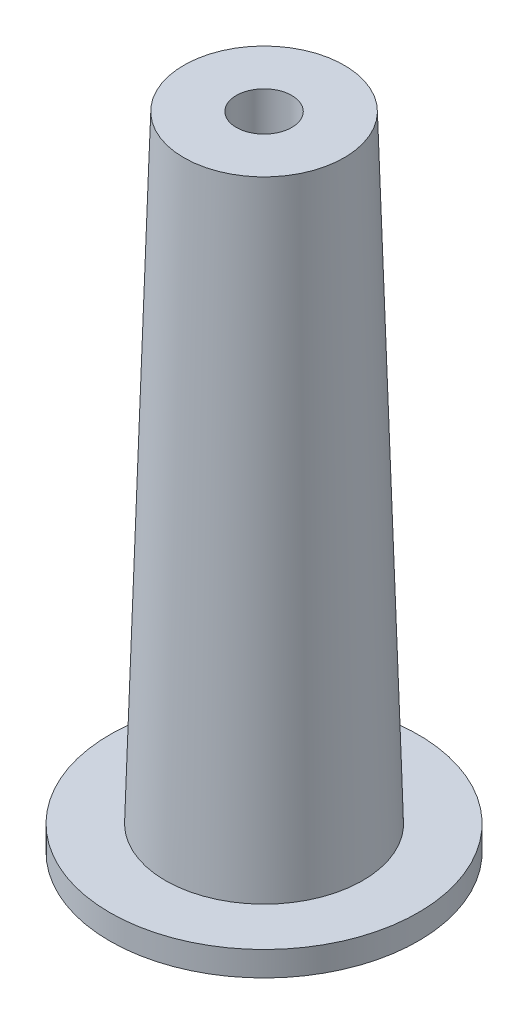
ISO-10303-21;
HEADER;
FILE_DESCRIPTION(('STEP AP214'),'2;1');
FILE_NAME('part.step','',(''),(''),'','','');
FILE_SCHEMA(('AUTOMOTIVE_DESIGN { 1 0 10303 214 1 1 1 1 }'));
ENDSEC;
DATA;
#1=APPLICATION_CONTEXT('core data for automotive mechanical design processes');
#2=APPLICATION_PROTOCOL_DEFINITION('international standard','automotive_design',2000,#1);
#3=PRODUCT_CONTEXT('',#1,'mechanical');
#4=PRODUCT('Part','Part','',(#3));
#5=PRODUCT_RELATED_PRODUCT_CATEGORY('part','',(#4));
#6=PRODUCT_DEFINITION_FORMATION('','',#4);
#7=PRODUCT_DEFINITION_CONTEXT('part definition',#1,'design');
#8=PRODUCT_DEFINITION('design','',#6,#7);
#9=PRODUCT_DEFINITION_SHAPE('','',#8);
#10=(LENGTH_UNIT() NAMED_UNIT(*) SI_UNIT(.MILLI.,.METRE.));
#11=(NAMED_UNIT(*) PLANE_ANGLE_UNIT() SI_UNIT($,.RADIAN.));
#12=(NAMED_UNIT(*) SI_UNIT($,.STERADIAN.) SOLID_ANGLE_UNIT());
#13=UNCERTAINTY_MEASURE_WITH_UNIT(LENGTH_MEASURE(1.E-05),#10,'distance_accuracy_value','');
#14=(GEOMETRIC_REPRESENTATION_CONTEXT(3) GLOBAL_UNCERTAINTY_ASSIGNED_CONTEXT((#13)) GLOBAL_UNIT_ASSIGNED_CONTEXT((#10,
#11,#12)) REPRESENTATION_CONTEXT('',''));
#15=CARTESIAN_POINT('',(0.,0.,0.));
#16=DIRECTION('',(0.,0.,1.));
#17=DIRECTION('',(1.,0.,0.));
#18=AXIS2_PLACEMENT_3D('',#15,#16,#17);
#19=CARTESIAN_POINT('',(0.,4.,0.));
#20=DIRECTION('',(0.,-1.,0.));
#21=DIRECTION('',(0.,0.,-1.));
#22=AXIS2_PLACEMENT_3D('',#19,#20,#21);
#23=CYLINDRICAL_SURFACE('',#22,25.);
#24=CARTESIAN_POINT('',(0.,4.,0.));
#25=DIRECTION('',(0.,1.,0.));
#26=DIRECTION('',(0.,0.,1.));
#27=AXIS2_PLACEMENT_3D('',#24,#25,#26);
#28=CIRCLE('',#27,25.);
#29=CARTESIAN_POINT('',(0.,4.,25.));
#30=VERTEX_POINT('',#29);
#31=EDGE_CURVE('E37',#30,#30,#28,.T.);
#32=ORIENTED_EDGE('',*,*,#31,.F.);
#33=EDGE_LOOP('',(#32));
#34=FACE_BOUND('',#33,.T.);
#35=CARTESIAN_POINT('',(0.,0.,0.));
#36=DIRECTION('',(0.,1.,0.));
#37=DIRECTION('',(0.,0.,1.));
#38=AXIS2_PLACEMENT_3D('',#35,#36,#37);
#39=CIRCLE('',#38,25.);
#40=CARTESIAN_POINT('',(0.,0.,25.));
#41=VERTEX_POINT('',#40);
#42=EDGE_CURVE('E41',#41,#41,#39,.T.);
#43=ORIENTED_EDGE('',*,*,#42,.T.);
#44=EDGE_LOOP('',(#43));
#45=FACE_BOUND('',#44,.T.);
#46=ADVANCED_FACE('F31',(#34,#45),#23,.T.);
#47=CARTESIAN_POINT('',(0.,4.,0.));
#48=DIRECTION('',(0.,1.,0.));
#49=DIRECTION('',(0.,0.,1.));
#50=AXIS2_PLACEMENT_3D('',#47,#48,#49);
#51=PLANE('',#50);
#52=CARTESIAN_POINT('',(0.,4.,0.));
#53=DIRECTION('',(0.,1.,0.));
#54=DIRECTION('',(0.,0.,1.));
#55=AXIS2_PLACEMENT_3D('',#52,#53,#54);
#56=CIRCLE('',#55,16.);
#57=CARTESIAN_POINT('',(0.,4.,16.));
#58=VERTEX_POINT('',#57);
#59=EDGE_CURVE('E10',#58,#58,#56,.T.);
#60=ORIENTED_EDGE('',*,*,#59,.F.);
#61=EDGE_LOOP('',(#60));
#62=FACE_BOUND('',#61,.T.);
#63=ORIENTED_EDGE('',*,*,#31,.T.);
#64=EDGE_LOOP('',(#63));
#65=FACE_BOUND('',#64,.T.);
#66=ADVANCED_FACE('F72',(#62,#65),#51,.T.);
#67=CARTESIAN_POINT('',(0.,0.,0.));
#68=DIRECTION('',(0.,1.,0.));
#69=DIRECTION('',(0.,0.,1.));
#70=AXIS2_PLACEMENT_3D('',#67,#68,#69);
#71=PLANE('',#70);
#72=CARTESIAN_POINT('',(0.,0.,0.));
#73=DIRECTION('',(0.,1.,0.));
#74=DIRECTION('',(0.,0.,1.));
#75=AXIS2_PLACEMENT_3D('',#72,#73,#74);
#76=CIRCLE('',#75,4.5);
#77=CARTESIAN_POINT('',(0.,0.,4.5));
#78=VERTEX_POINT('',#77);
#79=EDGE_CURVE('E50',#78,#78,#76,.T.);
#80=ORIENTED_EDGE('',*,*,#79,.T.);
#81=EDGE_LOOP('',(#80));
#82=FACE_BOUND('',#81,.T.);
#83=ORIENTED_EDGE('',*,*,#42,.F.);
#84=EDGE_LOOP('',(#83));
#85=FACE_BOUND('',#84,.T.);
#86=ADVANCED_FACE('F67',(#82,#85),#71,.F.);
#87=CARTESIAN_POINT('',(0.,104.,0.));
#88=DIRECTION('',(0.,-1.,0.));
#89=DIRECTION('',(0.,0.,-1.));
#90=AXIS2_PLACEMENT_3D('',#87,#88,#89);
#91=CONICAL_SURFACE('',#90,13.,0.0299910048568779);
#92=ORIENTED_EDGE('',*,*,#59,.T.);
#93=EDGE_LOOP('',(#92));
#94=FACE_BOUND('',#93,.T.);
#95=CARTESIAN_POINT('',(0.,104.,0.));
#96=DIRECTION('',(0.,1.,0.));
#97=DIRECTION('',(0.,0.,1.));
#98=AXIS2_PLACEMENT_3D('',#95,#96,#97);
#99=CIRCLE('',#98,13.);
#100=CARTESIAN_POINT('',(0.,104.,13.));
#101=VERTEX_POINT('',#100);
#102=EDGE_CURVE('E46',#101,#101,#99,.T.);
#103=ORIENTED_EDGE('',*,*,#102,.F.);
#104=EDGE_LOOP('',(#103));
#105=FACE_BOUND('',#104,.T.);
#106=ADVANCED_FACE('F62',(#94,#105),#91,.T.);
#107=CARTESIAN_POINT('',(0.,104.,13.));
#108=DIRECTION('',(0.,1.,0.));
#109=DIRECTION('',(0.,0.,1.));
#110=AXIS2_PLACEMENT_3D('',#107,#108,#109);
#111=PLANE('',#110);
#112=CARTESIAN_POINT('',(0.,104.,0.));
#113=DIRECTION('',(0.,1.,0.));
#114=DIRECTION('',(0.,0.,1.));
#115=AXIS2_PLACEMENT_3D('',#112,#113,#114);
#116=CIRCLE('',#115,4.5);
#117=CARTESIAN_POINT('',(0.,104.,4.5));
#118=VERTEX_POINT('',#117);
#119=EDGE_CURVE('E53',#118,#118,#116,.T.);
#120=ORIENTED_EDGE('',*,*,#119,.F.);
#121=EDGE_LOOP('',(#120));
#122=FACE_BOUND('',#121,.T.);
#123=ORIENTED_EDGE('',*,*,#102,.T.);
#124=EDGE_LOOP('',(#123));
#125=FACE_BOUND('',#124,.T.);
#126=ADVANCED_FACE('F59',(#122,#125),#111,.T.);
#127=CARTESIAN_POINT('',(0.,0.,0.));
#128=DIRECTION('',(0.,1.,0.));
#129=DIRECTION('',(0.,0.,1.));
#130=AXIS2_PLACEMENT_3D('',#127,#128,#129);
#131=CYLINDRICAL_SURFACE('',#130,4.5);
#132=ORIENTED_EDGE('',*,*,#79,.F.);
#133=EDGE_LOOP('',(#132));
#134=FACE_BOUND('',#133,.T.);
#135=ORIENTED_EDGE('',*,*,#119,.T.);
#136=EDGE_LOOP('',(#135));
#137=FACE_BOUND('',#136,.T.);
#138=ADVANCED_FACE('F57',(#134,#137),#131,.F.);
#139=CLOSED_SHELL('',(#46,#66,#86,#106,#126,#138));
#140=MANIFOLD_SOLID_BREP('B2',#139);
#141=ADVANCED_BREP_SHAPE_REPRESENTATION('',(#18,#140),#14);
#142=SHAPE_DEFINITION_REPRESENTATION(#9,#141);
ENDSEC;
END-ISO-10303-21;
